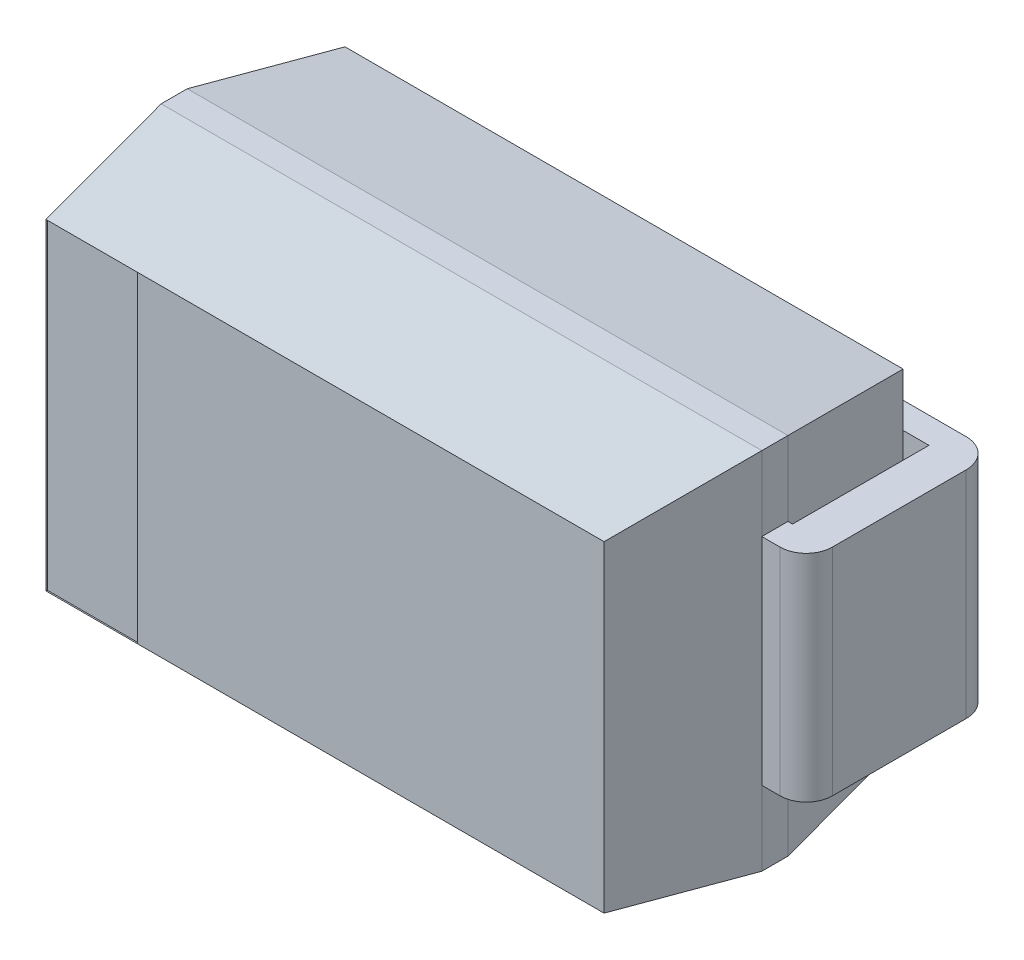
ISO-10303-21;
HEADER;
FILE_DESCRIPTION(('STEP AP214'),'2;1');
FILE_NAME('part.step','',(''),(''),'','','');
FILE_SCHEMA(('AUTOMOTIVE_DESIGN { 1 0 10303 214 1 1 1 1 }'));
ENDSEC;
DATA;
#1=APPLICATION_CONTEXT('core data for automotive mechanical design processes');
#2=APPLICATION_PROTOCOL_DEFINITION('international standard','automotive_design',2000,#1);
#3=PRODUCT_CONTEXT('',#1,'mechanical');
#4=PRODUCT('Part','Part','',(#3));
#5=PRODUCT_RELATED_PRODUCT_CATEGORY('part','',(#4));
#6=PRODUCT_DEFINITION_FORMATION('','',#4);
#7=PRODUCT_DEFINITION_CONTEXT('part definition',#1,'design');
#8=PRODUCT_DEFINITION('design','',#6,#7);
#9=PRODUCT_DEFINITION_SHAPE('','',#8);
#10=(LENGTH_UNIT() NAMED_UNIT(*) SI_UNIT(.MILLI.,.METRE.));
#11=(NAMED_UNIT(*) PLANE_ANGLE_UNIT() SI_UNIT($,.RADIAN.));
#12=(NAMED_UNIT(*) SI_UNIT($,.STERADIAN.) SOLID_ANGLE_UNIT());
#13=UNCERTAINTY_MEASURE_WITH_UNIT(LENGTH_MEASURE(1.E-05),#10,'distance_accuracy_value','');
#14=(GEOMETRIC_REPRESENTATION_CONTEXT(3) GLOBAL_UNCERTAINTY_ASSIGNED_CONTEXT((#13)) GLOBAL_UNIT_ASSIGNED_CONTEXT((#10,
#11,#12)) REPRESENTATION_CONTEXT('',''));
#15=CARTESIAN_POINT('',(0.,0.,0.));
#16=DIRECTION('',(0.,0.,1.));
#17=DIRECTION('',(1.,0.,0.));
#18=AXIS2_PLACEMENT_3D('',#15,#16,#17);
#19=CARTESIAN_POINT('',(2.3,-0.825,1.44500000000002));
#20=DIRECTION('',(0.,0.,1.));
#21=DIRECTION('',(-1.,0.,0.));
#22=AXIS2_PLACEMENT_3D('',#19,#20,#21);
#23=PLANE('',#22);
#24=DIRECTION('',(0.,1.,0.));
#25=VECTOR('',#24,1.);
#26=CARTESIAN_POINT('',(2.3,-0.825,1.44500000000002));
#27=LINE('',#26,#25);
#28=CARTESIAN_POINT('',(2.3,-0.825,1.44500000000002));
#29=VERTEX_POINT('',#28);
#30=CARTESIAN_POINT('',(2.3,0.825,1.44500000000002));
#31=VERTEX_POINT('',#30);
#32=EDGE_CURVE('E53',#29,#31,#27,.T.);
#33=ORIENTED_EDGE('',*,*,#32,.F.);
#34=DIRECTION('',(-1.,0.,0.));
#35=VECTOR('',#34,1.);
#36=CARTESIAN_POINT('',(2.3,-0.825,1.44500000000002));
#37=LINE('',#36,#35);
#38=CARTESIAN_POINT('',(2.44,-0.825,1.44500000000002));
#39=VERTEX_POINT('',#38);
#40=EDGE_CURVE('E199',#39,#29,#37,.T.);
#41=ORIENTED_EDGE('',*,*,#40,.F.);
#42=DIRECTION('',(0.,1.,0.));
#43=VECTOR('',#42,1.);
#44=CARTESIAN_POINT('',(2.44,-0.825,1.44500000000002));
#45=LINE('',#44,#43);
#46=CARTESIAN_POINT('',(2.44,0.825,1.44500000000002));
#47=VERTEX_POINT('',#46);
#48=EDGE_CURVE('E12',#39,#47,#45,.T.);
#49=ORIENTED_EDGE('',*,*,#48,.T.);
#50=DIRECTION('',(-1.,0.,0.));
#51=VECTOR('',#50,1.);
#52=CARTESIAN_POINT('',(2.3,0.825,1.44500000000002));
#53=LINE('',#52,#51);
#54=EDGE_CURVE('E132',#47,#31,#53,.T.);
#55=ORIENTED_EDGE('',*,*,#54,.T.);
#56=EDGE_LOOP('',(#33,#41,#49,#55));
#57=FACE_BOUND('',#56,.T.);
#58=ADVANCED_FACE('F50',(#57),#23,.T.);
#59=CARTESIAN_POINT('',(2.44,-0.825,1.24500000000002));
#60=DIRECTION('',(0.,1.,0.));
#61=DIRECTION('',(0.,0.,1.));
#62=AXIS2_PLACEMENT_3D('',#59,#60,#61);
#63=CYLINDRICAL_SURFACE('',#62,0.2);
#64=ORIENTED_EDGE('',*,*,#48,.F.);
#65=CARTESIAN_POINT('',(2.44,-0.825,1.24500000000002));
#66=DIRECTION('',(0.,-1.,0.));
#67=DIRECTION('',(0.,0.,-1.));
#68=AXIS2_PLACEMENT_3D('',#65,#66,#67);
#69=CIRCLE('',#68,0.2);
#70=CARTESIAN_POINT('',(2.64,-0.825,1.24500000000002));
#71=VERTEX_POINT('',#70);
#72=EDGE_CURVE('E66',#71,#39,#69,.T.);
#73=ORIENTED_EDGE('',*,*,#72,.F.);
#74=DIRECTION('',(0.,1.,0.));
#75=VECTOR('',#74,1.);
#76=CARTESIAN_POINT('',(2.64,-0.825,1.24500000000002));
#77=LINE('',#76,#75);
#78=CARTESIAN_POINT('',(2.64,0.825,1.24500000000002));
#79=VERTEX_POINT('',#78);
#80=EDGE_CURVE('E58',#71,#79,#77,.T.);
#81=ORIENTED_EDGE('',*,*,#80,.T.);
#82=CARTESIAN_POINT('',(2.44,0.825,1.24500000000002));
#83=DIRECTION('',(0.,-1.,0.));
#84=DIRECTION('',(0.,0.,-1.));
#85=AXIS2_PLACEMENT_3D('',#82,#83,#84);
#86=CIRCLE('',#85,0.2);
#87=EDGE_CURVE('E197',#79,#47,#86,.T.);
#88=ORIENTED_EDGE('',*,*,#87,.T.);
#89=EDGE_LOOP('',(#64,#73,#81,#88));
#90=FACE_BOUND('',#89,.T.);
#91=ADVANCED_FACE('F221',(#90),#63,.T.);
#92=CARTESIAN_POINT('',(2.64,-0.825,1.24500000000002));
#93=DIRECTION('',(1.,0.,0.));
#94=DIRECTION('',(0.,0.,1.));
#95=AXIS2_PLACEMENT_3D('',#92,#93,#94);
#96=PLANE('',#95);
#97=ORIENTED_EDGE('',*,*,#80,.F.);
#98=DIRECTION('',(0.,0.,1.));
#99=VECTOR('',#98,1.);
#100=CARTESIAN_POINT('',(2.64,-0.825,1.24500000000002));
#101=LINE('',#100,#99);
#102=CARTESIAN_POINT('',(2.64,-0.825,0.22));
#103=VERTEX_POINT('',#102);
#104=EDGE_CURVE('E71',#103,#71,#101,.T.);
#105=ORIENTED_EDGE('',*,*,#104,.F.);
#106=DIRECTION('',(0.,1.,0.));
#107=VECTOR('',#106,1.);
#108=CARTESIAN_POINT('',(2.64,-0.825,0.22));
#109=LINE('',#108,#107);
#110=CARTESIAN_POINT('',(2.64,0.825,0.22));
#111=VERTEX_POINT('',#110);
#112=EDGE_CURVE('E155',#103,#111,#109,.T.);
#113=ORIENTED_EDGE('',*,*,#112,.T.);
#114=DIRECTION('',(0.,0.,1.));
#115=VECTOR('',#114,1.);
#116=CARTESIAN_POINT('',(2.64,0.825,1.24500000000002));
#117=LINE('',#116,#115);
#118=EDGE_CURVE('E195',#111,#79,#117,.T.);
#119=ORIENTED_EDGE('',*,*,#118,.T.);
#120=EDGE_LOOP('',(#97,#105,#113,#119));
#121=FACE_BOUND('',#120,.T.);
#122=ADVANCED_FACE('F219',(#121),#96,.T.);
#123=CARTESIAN_POINT('',(2.42,-0.825,0.22));
#124=DIRECTION('',(0.,1.,0.));
#125=DIRECTION('',(0.,0.,1.));
#126=AXIS2_PLACEMENT_3D('',#123,#124,#125);
#127=CYLINDRICAL_SURFACE('',#126,0.22);
#128=ORIENTED_EDGE('',*,*,#112,.F.);
#129=CARTESIAN_POINT('',(2.42,-0.825,0.22));
#130=DIRECTION('',(0.,-1.,0.));
#131=DIRECTION('',(0.,0.,1.));
#132=AXIS2_PLACEMENT_3D('',#129,#130,#131);
#133=CIRCLE('',#132,0.22);
#134=CARTESIAN_POINT('',(2.42,-0.825,0.));
#135=VERTEX_POINT('',#134);
#136=EDGE_CURVE('E149',#135,#103,#133,.T.);
#137=ORIENTED_EDGE('',*,*,#136,.F.);
#138=DIRECTION('',(0.,1.,0.));
#139=VECTOR('',#138,1.);
#140=CARTESIAN_POINT('',(2.42,-0.825,0.));
#141=LINE('',#140,#139);
#142=CARTESIAN_POINT('',(2.42,0.825,0.));
#143=VERTEX_POINT('',#142);
#144=EDGE_CURVE('E158',#135,#143,#141,.T.);
#145=ORIENTED_EDGE('',*,*,#144,.T.);
#146=CARTESIAN_POINT('',(2.42,0.825,0.22));
#147=DIRECTION('',(0.,-1.,0.));
#148=DIRECTION('',(0.,0.,1.));
#149=AXIS2_PLACEMENT_3D('',#146,#147,#148);
#150=CIRCLE('',#149,0.22);
#151=EDGE_CURVE('E193',#143,#111,#150,.T.);
#152=ORIENTED_EDGE('',*,*,#151,.T.);
#153=EDGE_LOOP('',(#128,#137,#145,#152));
#154=FACE_BOUND('',#153,.T.);
#155=ADVANCED_FACE('F215',(#154),#127,.T.);
#156=CARTESIAN_POINT('',(1.12,-0.825,0.));
#157=DIRECTION('',(0.,0.,-1.));
#158=DIRECTION('',(1.,0.,0.));
#159=AXIS2_PLACEMENT_3D('',#156,#157,#158);
#160=PLANE('',#159);
#161=ORIENTED_EDGE('',*,*,#144,.F.);
#162=DIRECTION('',(1.,0.,0.));
#163=VECTOR('',#162,1.);
#164=CARTESIAN_POINT('',(1.12,-0.825,0.));
#165=LINE('',#164,#163);
#166=CARTESIAN_POINT('',(1.12,-0.825,0.));
#167=VERTEX_POINT('',#166);
#168=EDGE_CURVE('E208',#167,#135,#165,.T.);
#169=ORIENTED_EDGE('',*,*,#168,.F.);
#170=DIRECTION('',(0.,1.,0.));
#171=VECTOR('',#170,1.);
#172=CARTESIAN_POINT('',(1.12,-0.825,0.));
#173=LINE('',#172,#171);
#174=CARTESIAN_POINT('',(1.12,0.825,0.));
#175=VERTEX_POINT('',#174);
#176=EDGE_CURVE('E161',#167,#175,#173,.T.);
#177=ORIENTED_EDGE('',*,*,#176,.T.);
#178=DIRECTION('',(1.,0.,0.));
#179=VECTOR('',#178,1.);
#180=CARTESIAN_POINT('',(1.12,0.825,0.));
#181=LINE('',#180,#179);
#182=EDGE_CURVE('E191',#175,#143,#181,.T.);
#183=ORIENTED_EDGE('',*,*,#182,.T.);
#184=EDGE_LOOP('',(#161,#169,#177,#183));
#185=FACE_BOUND('',#184,.T.);
#186=ADVANCED_FACE('F232',(#185),#160,.T.);
#187=CARTESIAN_POINT('',(1.12,-0.825,0.));
#188=DIRECTION('',(-1.,0.,0.));
#189=DIRECTION('',(0.,0.,-1.));
#190=AXIS2_PLACEMENT_3D('',#187,#188,#189);
#191=PLANE('',#190);
#192=ORIENTED_EDGE('',*,*,#176,.F.);
#193=DIRECTION('',(0.,0.,-1.));
#194=VECTOR('',#193,1.);
#195=CARTESIAN_POINT('',(1.12,-0.825,0.));
#196=LINE('',#195,#194);
#197=CARTESIAN_POINT('',(1.12,-0.825,0.2));
#198=VERTEX_POINT('',#197);
#199=EDGE_CURVE('E206',#198,#167,#196,.T.);
#200=ORIENTED_EDGE('',*,*,#199,.F.);
#201=DIRECTION('',(0.,1.,0.));
#202=VECTOR('',#201,1.);
#203=CARTESIAN_POINT('',(1.12,-0.825,0.2));
#204=LINE('',#203,#202);
#205=CARTESIAN_POINT('',(1.12,0.825,0.2));
#206=VERTEX_POINT('',#205);
#207=EDGE_CURVE('E164',#198,#206,#204,.T.);
#208=ORIENTED_EDGE('',*,*,#207,.T.);
#209=DIRECTION('',(0.,0.,-1.));
#210=VECTOR('',#209,1.);
#211=CARTESIAN_POINT('',(1.12,0.825,0.));
#212=LINE('',#211,#210);
#213=EDGE_CURVE('E187',#206,#175,#212,.T.);
#214=ORIENTED_EDGE('',*,*,#213,.T.);
#215=EDGE_LOOP('',(#192,#200,#208,#214));
#216=FACE_BOUND('',#215,.T.);
#217=ADVANCED_FACE('F229',(#216),#191,.T.);
#218=CARTESIAN_POINT('',(1.12,-0.825,0.2));
#219=DIRECTION('',(0.,0.,1.));
#220=DIRECTION('',(-1.,0.,0.));
#221=AXIS2_PLACEMENT_3D('',#218,#219,#220);
#222=PLANE('',#221);
#223=ORIENTED_EDGE('',*,*,#207,.F.);
#224=DIRECTION('',(-1.,0.,0.));
#225=VECTOR('',#224,1.);
#226=CARTESIAN_POINT('',(1.12,-0.825,0.2));
#227=LINE('',#226,#225);
#228=CARTESIAN_POINT('',(2.335,-0.825,0.2));
#229=VERTEX_POINT('',#228);
#230=EDGE_CURVE('E204',#229,#198,#227,.T.);
#231=ORIENTED_EDGE('',*,*,#230,.F.);
#232=DIRECTION('',(0.,1.,0.));
#233=VECTOR('',#232,1.);
#234=CARTESIAN_POINT('',(2.335,-0.825,0.2));
#235=LINE('',#234,#233);
#236=CARTESIAN_POINT('',(2.335,0.825,0.2));
#237=VERTEX_POINT('',#236);
#238=EDGE_CURVE('E167',#229,#237,#235,.T.);
#239=ORIENTED_EDGE('',*,*,#238,.T.);
#240=DIRECTION('',(-1.,0.,0.));
#241=VECTOR('',#240,1.);
#242=CARTESIAN_POINT('',(1.12,0.825,0.2));
#243=LINE('',#242,#241);
#244=EDGE_CURVE('E185',#237,#206,#243,.T.);
#245=ORIENTED_EDGE('',*,*,#244,.T.);
#246=EDGE_LOOP('',(#223,#231,#239,#245));
#247=FACE_BOUND('',#246,.T.);
#248=ADVANCED_FACE('F225',(#247),#222,.T.);
#249=CARTESIAN_POINT('',(2.335,-0.825,0.2));
#250=DIRECTION('',(-1.,0.,0.));
#251=DIRECTION('',(0.,0.,-1.));
#252=AXIS2_PLACEMENT_3D('',#249,#250,#251);
#253=PLANE('',#252);
#254=ORIENTED_EDGE('',*,*,#238,.F.);
#255=DIRECTION('',(0.,0.,-1.));
#256=VECTOR('',#255,1.);
#257=CARTESIAN_POINT('',(2.335,-0.825,0.2));
#258=LINE('',#257,#256);
#259=CARTESIAN_POINT('',(2.335,-0.825,1.24500000000002));
#260=VERTEX_POINT('',#259);
#261=EDGE_CURVE('E178',#260,#229,#258,.T.);
#262=ORIENTED_EDGE('',*,*,#261,.F.);
#263=DIRECTION('',(0.,1.,0.));
#264=VECTOR('',#263,1.);
#265=CARTESIAN_POINT('',(2.335,-0.825,1.24500000000002));
#266=LINE('',#265,#264);
#267=CARTESIAN_POINT('',(2.335,0.825,1.24500000000002));
#268=VERTEX_POINT('',#267);
#269=EDGE_CURVE('E147',#260,#268,#266,.T.);
#270=ORIENTED_EDGE('',*,*,#269,.T.);
#271=DIRECTION('',(0.,0.,-1.));
#272=VECTOR('',#271,1.);
#273=CARTESIAN_POINT('',(2.335,0.825,0.2));
#274=LINE('',#273,#272);
#275=EDGE_CURVE('E176',#268,#237,#274,.T.);
#276=ORIENTED_EDGE('',*,*,#275,.T.);
#277=EDGE_LOOP('',(#254,#262,#270,#276));
#278=FACE_BOUND('',#277,.T.);
#279=ADVANCED_FACE('F175',(#278),#253,.T.);
#280=CARTESIAN_POINT('',(2.335,-0.825,1.24500000000002));
#281=DIRECTION('',(0.,0.,-1.));
#282=DIRECTION('',(1.,0.,0.));
#283=AXIS2_PLACEMENT_3D('',#280,#281,#282);
#284=PLANE('',#283);
#285=ORIENTED_EDGE('',*,*,#269,.F.);
#286=DIRECTION('',(1.,0.,0.));
#287=VECTOR('',#286,1.);
#288=CARTESIAN_POINT('',(2.335,-0.825,1.24500000000002));
#289=LINE('',#288,#287);
#290=CARTESIAN_POINT('',(2.3,-0.825,1.24500000000002));
#291=VERTEX_POINT('',#290);
#292=EDGE_CURVE('E182',#291,#260,#289,.T.);
#293=ORIENTED_EDGE('',*,*,#292,.F.);
#294=DIRECTION('',(0.,1.,0.));
#295=VECTOR('',#294,1.);
#296=CARTESIAN_POINT('',(2.3,-0.825,1.24500000000002));
#297=LINE('',#296,#295);
#298=CARTESIAN_POINT('',(2.3,0.825,1.24500000000002));
#299=VERTEX_POINT('',#298);
#300=EDGE_CURVE('E146',#291,#299,#297,.T.);
#301=ORIENTED_EDGE('',*,*,#300,.T.);
#302=DIRECTION('',(1.,0.,0.));
#303=VECTOR('',#302,1.);
#304=CARTESIAN_POINT('',(2.335,0.825,1.24500000000002));
#305=LINE('',#304,#303);
#306=EDGE_CURVE('E134',#299,#268,#305,.T.);
#307=ORIENTED_EDGE('',*,*,#306,.T.);
#308=EDGE_LOOP('',(#285,#293,#301,#307));
#309=FACE_BOUND('',#308,.T.);
#310=ADVANCED_FACE('F181',(#309),#284,.T.);
#311=CARTESIAN_POINT('',(2.3,-0.825,1.24500000000002));
#312=DIRECTION('',(-1.,0.,0.));
#313=DIRECTION('',(0.,0.,-1.));
#314=AXIS2_PLACEMENT_3D('',#311,#312,#313);
#315=PLANE('',#314);
#316=ORIENTED_EDGE('',*,*,#300,.F.);
#317=DIRECTION('',(0.,0.,-1.));
#318=VECTOR('',#317,1.);
#319=CARTESIAN_POINT('',(2.3,-0.825,1.24500000000002));
#320=LINE('',#319,#318);
#321=EDGE_CURVE('E145',#29,#291,#320,.T.);
#322=ORIENTED_EDGE('',*,*,#321,.F.);
#323=ORIENTED_EDGE('',*,*,#32,.T.);
#324=DIRECTION('',(0.,0.,-1.));
#325=VECTOR('',#324,1.);
#326=CARTESIAN_POINT('',(2.3,0.825,1.24500000000002));
#327=LINE('',#326,#325);
#328=EDGE_CURVE('E128',#31,#299,#327,.T.);
#329=ORIENTED_EDGE('',*,*,#328,.T.);
#330=EDGE_LOOP('',(#316,#322,#323,#329));
#331=FACE_BOUND('',#330,.T.);
#332=ADVANCED_FACE('F144',(#331),#315,.T.);
#333=CARTESIAN_POINT('',(2.44,-0.825,1.24500000000002));
#334=DIRECTION('',(0.,-1.,0.));
#335=DIRECTION('',(0.,0.,-1.));
#336=AXIS2_PLACEMENT_3D('',#333,#334,#335);
#337=PLANE('',#336);
#338=ORIENTED_EDGE('',*,*,#40,.T.);
#339=ORIENTED_EDGE('',*,*,#321,.T.);
#340=ORIENTED_EDGE('',*,*,#292,.T.);
#341=ORIENTED_EDGE('',*,*,#261,.T.);
#342=ORIENTED_EDGE('',*,*,#230,.T.);
#343=ORIENTED_EDGE('',*,*,#199,.T.);
#344=ORIENTED_EDGE('',*,*,#168,.T.);
#345=ORIENTED_EDGE('',*,*,#136,.T.);
#346=ORIENTED_EDGE('',*,*,#104,.T.);
#347=ORIENTED_EDGE('',*,*,#72,.T.);
#348=EDGE_LOOP('',(#338,#339,#340,#341,#342,#343,#344,#345,#346,#347));
#349=FACE_BOUND('',#348,.T.);
#350=ADVANCED_FACE('F211',(#349),#337,.T.);
#351=CARTESIAN_POINT('',(2.44,0.825,1.24500000000002));
#352=DIRECTION('',(0.,-1.,0.));
#353=DIRECTION('',(0.,0.,-1.));
#354=AXIS2_PLACEMENT_3D('',#351,#352,#353);
#355=PLANE('',#354);
#356=ORIENTED_EDGE('',*,*,#54,.F.);
#357=ORIENTED_EDGE('',*,*,#87,.F.);
#358=ORIENTED_EDGE('',*,*,#118,.F.);
#359=ORIENTED_EDGE('',*,*,#151,.F.);
#360=ORIENTED_EDGE('',*,*,#182,.F.);
#361=ORIENTED_EDGE('',*,*,#213,.F.);
#362=ORIENTED_EDGE('',*,*,#244,.F.);
#363=ORIENTED_EDGE('',*,*,#275,.F.);
#364=ORIENTED_EDGE('',*,*,#306,.F.);
#365=ORIENTED_EDGE('',*,*,#328,.F.);
#366=EDGE_LOOP('',(#356,#357,#358,#359,#360,#361,#362,#363,#364,#365));
#367=FACE_BOUND('',#366,.T.);
#368=ADVANCED_FACE('F130',(#367),#355,.F.);
#369=CLOSED_SHELL('',(#58,#91,#122,#155,#186,#217,#248,#279,#310,#332,#350,#368));
#370=MANIFOLD_SOLID_BREP('B2',#369);
#371=CARTESIAN_POINT('',(-2.3,-0.825,1.44500000000002));
#372=DIRECTION('',(0.,0.,1.));
#373=DIRECTION('',(1.,0.,0.));
#374=AXIS2_PLACEMENT_3D('',#371,#372,#373);
#375=PLANE('',#374);
#376=DIRECTION('',(0.,1.,0.));
#377=VECTOR('',#376,1.);
#378=CARTESIAN_POINT('',(-2.3,-0.825,1.44500000000002));
#379=LINE('',#378,#377);
#380=CARTESIAN_POINT('',(-2.3,-0.825,1.44500000000002));
#381=VERTEX_POINT('',#380);
#382=CARTESIAN_POINT('',(-2.3,0.825,1.44500000000002));
#383=VERTEX_POINT('',#382);
#384=EDGE_CURVE('E366',#381,#383,#379,.T.);
#385=ORIENTED_EDGE('',*,*,#384,.T.);
#386=DIRECTION('',(1.,0.,0.));
#387=VECTOR('',#386,1.);
#388=CARTESIAN_POINT('',(-2.3,0.825,1.44500000000002));
#389=LINE('',#388,#387);
#390=CARTESIAN_POINT('',(-2.44,0.825,1.44500000000002));
#391=VERTEX_POINT('',#390);
#392=EDGE_CURVE('E439',#391,#383,#389,.T.);
#393=ORIENTED_EDGE('',*,*,#392,.F.);
#394=DIRECTION('',(0.,1.,0.));
#395=VECTOR('',#394,1.);
#396=CARTESIAN_POINT('',(-2.44,-0.825,1.44500000000002));
#397=LINE('',#396,#395);
#398=CARTESIAN_POINT('',(-2.44,-0.825,1.44500000000002));
#399=VERTEX_POINT('',#398);
#400=EDGE_CURVE('E48',#399,#391,#397,.T.);
#401=ORIENTED_EDGE('',*,*,#400,.F.);
#402=DIRECTION('',(1.,0.,0.));
#403=VECTOR('',#402,1.);
#404=CARTESIAN_POINT('',(-2.3,-0.825,1.44500000000002));
#405=LINE('',#404,#403);
#406=EDGE_CURVE('E440',#399,#381,#405,.T.);
#407=ORIENTED_EDGE('',*,*,#406,.T.);
#408=EDGE_LOOP('',(#385,#393,#401,#407));
#409=FACE_BOUND('',#408,.T.);
#410=ADVANCED_FACE('F363',(#409),#375,.T.);
#411=CARTESIAN_POINT('',(-2.44,-0.825,1.24500000000002));
#412=DIRECTION('',(0.,1.,0.));
#413=DIRECTION('',(0.,0.,1.));
#414=AXIS2_PLACEMENT_3D('',#411,#412,#413);
#415=CYLINDRICAL_SURFACE('',#414,0.2);
#416=ORIENTED_EDGE('',*,*,#400,.T.);
#417=CARTESIAN_POINT('',(-2.44,0.825,1.24500000000002));
#418=DIRECTION('',(0.,1.,0.));
#419=DIRECTION('',(0.,0.,-1.));
#420=AXIS2_PLACEMENT_3D('',#417,#418,#419);
#421=CIRCLE('',#420,0.2);
#422=CARTESIAN_POINT('',(-2.64,0.825,1.24500000000002));
#423=VERTEX_POINT('',#422);
#424=EDGE_CURVE('E457',#423,#391,#421,.T.);
#425=ORIENTED_EDGE('',*,*,#424,.F.);
#426=DIRECTION('',(0.,1.,0.));
#427=VECTOR('',#426,1.);
#428=CARTESIAN_POINT('',(-2.64,-0.825,1.24500000000002));
#429=LINE('',#428,#427);
#430=CARTESIAN_POINT('',(-2.64,-0.825,1.24500000000002));
#431=VERTEX_POINT('',#430);
#432=EDGE_CURVE('E371',#431,#423,#429,.T.);
#433=ORIENTED_EDGE('',*,*,#432,.F.);
#434=CARTESIAN_POINT('',(-2.44,-0.825,1.24500000000002));
#435=DIRECTION('',(0.,1.,0.));
#436=DIRECTION('',(0.,0.,-1.));
#437=AXIS2_PLACEMENT_3D('',#434,#435,#436);
#438=CIRCLE('',#437,0.2);
#439=EDGE_CURVE('E445',#431,#399,#438,.T.);
#440=ORIENTED_EDGE('',*,*,#439,.T.);
#441=EDGE_LOOP('',(#416,#425,#433,#440));
#442=FACE_BOUND('',#441,.T.);
#443=ADVANCED_FACE('F545',(#442),#415,.T.);
#444=CARTESIAN_POINT('',(-2.64,-0.825,1.24500000000002));
#445=DIRECTION('',(-1.,0.,0.));
#446=DIRECTION('',(0.,0.,1.));
#447=AXIS2_PLACEMENT_3D('',#444,#445,#446);
#448=PLANE('',#447);
#449=ORIENTED_EDGE('',*,*,#432,.T.);
#450=DIRECTION('',(0.,0.,1.));
#451=VECTOR('',#450,1.);
#452=CARTESIAN_POINT('',(-2.64,0.825,1.24500000000002));
#453=LINE('',#452,#451);
#454=CARTESIAN_POINT('',(-2.64,0.825,0.22));
#455=VERTEX_POINT('',#454);
#456=EDGE_CURVE('E476',#455,#423,#453,.T.);
#457=ORIENTED_EDGE('',*,*,#456,.F.);
#458=DIRECTION('',(0.,1.,0.));
#459=VECTOR('',#458,1.);
#460=CARTESIAN_POINT('',(-2.64,-0.825,0.22));
#461=LINE('',#460,#459);
#462=CARTESIAN_POINT('',(-2.64,-0.825,0.22));
#463=VERTEX_POINT('',#462);
#464=EDGE_CURVE('E504',#463,#455,#461,.T.);
#465=ORIENTED_EDGE('',*,*,#464,.F.);
#466=DIRECTION('',(0.,0.,1.));
#467=VECTOR('',#466,1.);
#468=CARTESIAN_POINT('',(-2.64,-0.825,1.24500000000002));
#469=LINE('',#468,#467);
#470=EDGE_CURVE('E500',#463,#431,#469,.T.);
#471=ORIENTED_EDGE('',*,*,#470,.T.);
#472=EDGE_LOOP('',(#449,#457,#465,#471));
#473=FACE_BOUND('',#472,.T.);
#474=ADVANCED_FACE('F543',(#473),#448,.T.);
#475=CARTESIAN_POINT('',(-2.42,-0.825,0.22));
#476=DIRECTION('',(0.,1.,0.));
#477=DIRECTION('',(0.,0.,1.));
#478=AXIS2_PLACEMENT_3D('',#475,#476,#477);
#479=CYLINDRICAL_SURFACE('',#478,0.22);
#480=ORIENTED_EDGE('',*,*,#464,.T.);
#481=CARTESIAN_POINT('',(-2.42,0.825,0.22));
#482=DIRECTION('',(0.,1.,0.));
#483=DIRECTION('',(0.,0.,1.));
#484=AXIS2_PLACEMENT_3D('',#481,#482,#483);
#485=CIRCLE('',#484,0.22);
#486=CARTESIAN_POINT('',(-2.42,0.825,0.));
#487=VERTEX_POINT('',#486);
#488=EDGE_CURVE('E473',#487,#455,#485,.T.);
#489=ORIENTED_EDGE('',*,*,#488,.F.);
#490=DIRECTION('',(0.,1.,0.));
#491=VECTOR('',#490,1.);
#492=CARTESIAN_POINT('',(-2.42,-0.825,0.));
#493=LINE('',#492,#491);
#494=CARTESIAN_POINT('',(-2.42,-0.825,0.));
#495=VERTEX_POINT('',#494);
#496=EDGE_CURVE('E506',#495,#487,#493,.T.);
#497=ORIENTED_EDGE('',*,*,#496,.F.);
#498=CARTESIAN_POINT('',(-2.42,-0.825,0.22));
#499=DIRECTION('',(0.,1.,0.));
#500=DIRECTION('',(0.,0.,1.));
#501=AXIS2_PLACEMENT_3D('',#498,#499,#500);
#502=CIRCLE('',#501,0.22);
#503=EDGE_CURVE('E497',#495,#463,#502,.T.);
#504=ORIENTED_EDGE('',*,*,#503,.T.);
#505=EDGE_LOOP('',(#480,#489,#497,#504));
#506=FACE_BOUND('',#505,.T.);
#507=ADVANCED_FACE('F539',(#506),#479,.T.);
#508=CARTESIAN_POINT('',(-1.12,-0.825,0.));
#509=DIRECTION('',(0.,0.,-1.));
#510=DIRECTION('',(-1.,0.,0.));
#511=AXIS2_PLACEMENT_3D('',#508,#509,#510);
#512=PLANE('',#511);
#513=ORIENTED_EDGE('',*,*,#496,.T.);
#514=DIRECTION('',(-1.,0.,0.));
#515=VECTOR('',#514,1.);
#516=CARTESIAN_POINT('',(-1.12,0.825,0.));
#517=LINE('',#516,#515);
#518=CARTESIAN_POINT('',(-1.12,0.825,0.));
#519=VERTEX_POINT('',#518);
#520=EDGE_CURVE('E470',#519,#487,#517,.T.);
#521=ORIENTED_EDGE('',*,*,#520,.F.);
#522=DIRECTION('',(0.,1.,0.));
#523=VECTOR('',#522,1.);
#524=CARTESIAN_POINT('',(-1.12,-0.825,0.));
#525=LINE('',#524,#523);
#526=CARTESIAN_POINT('',(-1.12,-0.825,0.));
#527=VERTEX_POINT('',#526);
#528=EDGE_CURVE('E508',#527,#519,#525,.T.);
#529=ORIENTED_EDGE('',*,*,#528,.F.);
#530=DIRECTION('',(-1.,0.,0.));
#531=VECTOR('',#530,1.);
#532=CARTESIAN_POINT('',(-1.12,-0.825,0.));
#533=LINE('',#532,#531);
#534=EDGE_CURVE('E494',#527,#495,#533,.T.);
#535=ORIENTED_EDGE('',*,*,#534,.T.);
#536=EDGE_LOOP('',(#513,#521,#529,#535));
#537=FACE_BOUND('',#536,.T.);
#538=ADVANCED_FACE('F537',(#537),#512,.T.);
#539=CARTESIAN_POINT('',(-1.12,-0.825,0.));
#540=DIRECTION('',(1.,0.,0.));
#541=DIRECTION('',(0.,0.,-1.));
#542=AXIS2_PLACEMENT_3D('',#539,#540,#541);
#543=PLANE('',#542);
#544=ORIENTED_EDGE('',*,*,#528,.T.);
#545=DIRECTION('',(0.,0.,-1.));
#546=VECTOR('',#545,1.);
#547=CARTESIAN_POINT('',(-1.12,0.825,0.));
#548=LINE('',#547,#546);
#549=CARTESIAN_POINT('',(-1.12,0.825,0.2));
#550=VERTEX_POINT('',#549);
#551=EDGE_CURVE('E467',#550,#519,#548,.T.);
#552=ORIENTED_EDGE('',*,*,#551,.F.);
#553=DIRECTION('',(0.,1.,0.));
#554=VECTOR('',#553,1.);
#555=CARTESIAN_POINT('',(-1.12,-0.825,0.2));
#556=LINE('',#555,#554);
#557=CARTESIAN_POINT('',(-1.12,-0.825,0.2));
#558=VERTEX_POINT('',#557);
#559=EDGE_CURVE('E510',#558,#550,#556,.T.);
#560=ORIENTED_EDGE('',*,*,#559,.F.);
#561=DIRECTION('',(0.,0.,-1.));
#562=VECTOR('',#561,1.);
#563=CARTESIAN_POINT('',(-1.12,-0.825,0.));
#564=LINE('',#563,#562);
#565=EDGE_CURVE('E491',#558,#527,#564,.T.);
#566=ORIENTED_EDGE('',*,*,#565,.T.);
#567=EDGE_LOOP('',(#544,#552,#560,#566));
#568=FACE_BOUND('',#567,.T.);
#569=ADVANCED_FACE('F532',(#568),#543,.T.);
#570=CARTESIAN_POINT('',(-1.12,-0.825,0.2));
#571=DIRECTION('',(0.,0.,1.));
#572=DIRECTION('',(1.,0.,0.));
#573=AXIS2_PLACEMENT_3D('',#570,#571,#572);
#574=PLANE('',#573);
#575=ORIENTED_EDGE('',*,*,#559,.T.);
#576=DIRECTION('',(1.,0.,0.));
#577=VECTOR('',#576,1.);
#578=CARTESIAN_POINT('',(-1.12,0.825,0.2));
#579=LINE('',#578,#577);
#580=CARTESIAN_POINT('',(-2.335,0.825,0.2));
#581=VERTEX_POINT('',#580);
#582=EDGE_CURVE('E464',#581,#550,#579,.T.);
#583=ORIENTED_EDGE('',*,*,#582,.F.);
#584=DIRECTION('',(0.,1.,0.));
#585=VECTOR('',#584,1.);
#586=CARTESIAN_POINT('',(-2.335,-0.825,0.2));
#587=LINE('',#586,#585);
#588=CARTESIAN_POINT('',(-2.335,-0.825,0.2));
#589=VERTEX_POINT('',#588);
#590=EDGE_CURVE('E512',#589,#581,#587,.T.);
#591=ORIENTED_EDGE('',*,*,#590,.F.);
#592=DIRECTION('',(1.,0.,0.));
#593=VECTOR('',#592,1.);
#594=CARTESIAN_POINT('',(-1.12,-0.825,0.2));
#595=LINE('',#594,#593);
#596=EDGE_CURVE('E488',#589,#558,#595,.T.);
#597=ORIENTED_EDGE('',*,*,#596,.T.);
#598=EDGE_LOOP('',(#575,#583,#591,#597));
#599=FACE_BOUND('',#598,.T.);
#600=ADVANCED_FACE('F525',(#599),#574,.T.);
#601=CARTESIAN_POINT('',(-2.335,-0.825,0.2));
#602=DIRECTION('',(1.,0.,0.));
#603=DIRECTION('',(0.,0.,-1.));
#604=AXIS2_PLACEMENT_3D('',#601,#602,#603);
#605=PLANE('',#604);
#606=ORIENTED_EDGE('',*,*,#590,.T.);
#607=DIRECTION('',(0.,0.,-1.));
#608=VECTOR('',#607,1.);
#609=CARTESIAN_POINT('',(-2.335,0.825,0.2));
#610=LINE('',#609,#608);
#611=CARTESIAN_POINT('',(-2.335,0.825,1.24500000000002));
#612=VERTEX_POINT('',#611);
#613=EDGE_CURVE('E461',#612,#581,#610,.T.);
#614=ORIENTED_EDGE('',*,*,#613,.F.);
#615=DIRECTION('',(0.,1.,0.));
#616=VECTOR('',#615,1.);
#617=CARTESIAN_POINT('',(-2.335,-0.825,1.24500000000002));
#618=LINE('',#617,#616);
#619=CARTESIAN_POINT('',(-2.335,-0.825,1.24500000000002));
#620=VERTEX_POINT('',#619);
#621=EDGE_CURVE('E514',#620,#612,#618,.T.);
#622=ORIENTED_EDGE('',*,*,#621,.F.);
#623=DIRECTION('',(0.,0.,-1.));
#624=VECTOR('',#623,1.);
#625=CARTESIAN_POINT('',(-2.335,-0.825,0.2));
#626=LINE('',#625,#624);
#627=EDGE_CURVE('E485',#620,#589,#626,.T.);
#628=ORIENTED_EDGE('',*,*,#627,.T.);
#629=EDGE_LOOP('',(#606,#614,#622,#628));
#630=FACE_BOUND('',#629,.T.);
#631=ADVANCED_FACE('F522',(#630),#605,.T.);
#632=CARTESIAN_POINT('',(-2.335,-0.825,1.24500000000002));
#633=DIRECTION('',(0.,0.,-1.));
#634=DIRECTION('',(-1.,0.,0.));
#635=AXIS2_PLACEMENT_3D('',#632,#633,#634);
#636=PLANE('',#635);
#637=ORIENTED_EDGE('',*,*,#621,.T.);
#638=DIRECTION('',(-1.,0.,0.));
#639=VECTOR('',#638,1.);
#640=CARTESIAN_POINT('',(-2.335,0.825,1.24500000000002));
#641=LINE('',#640,#639);
#642=CARTESIAN_POINT('',(-2.3,0.825,1.24500000000002));
#643=VERTEX_POINT('',#642);
#644=EDGE_CURVE('E452',#643,#612,#641,.T.);
#645=ORIENTED_EDGE('',*,*,#644,.F.);
#646=DIRECTION('',(0.,1.,0.));
#647=VECTOR('',#646,1.);
#648=CARTESIAN_POINT('',(-2.3,-0.825,1.24500000000002));
#649=LINE('',#648,#647);
#650=CARTESIAN_POINT('',(-2.3,-0.825,1.24500000000002));
#651=VERTEX_POINT('',#650);
#652=EDGE_CURVE('E444',#651,#643,#649,.T.);
#653=ORIENTED_EDGE('',*,*,#652,.F.);
#654=DIRECTION('',(-1.,0.,0.));
#655=VECTOR('',#654,1.);
#656=CARTESIAN_POINT('',(-2.335,-0.825,1.24500000000002));
#657=LINE('',#656,#655);
#658=EDGE_CURVE('E482',#651,#620,#657,.T.);
#659=ORIENTED_EDGE('',*,*,#658,.T.);
#660=EDGE_LOOP('',(#637,#645,#653,#659));
#661=FACE_BOUND('',#660,.T.);
#662=ADVANCED_FACE('F516',(#661),#636,.T.);
#663=CARTESIAN_POINT('',(-2.3,-0.825,1.24500000000002));
#664=DIRECTION('',(1.,0.,0.));
#665=DIRECTION('',(0.,0.,-1.));
#666=AXIS2_PLACEMENT_3D('',#663,#664,#665);
#667=PLANE('',#666);
#668=ORIENTED_EDGE('',*,*,#652,.T.);
#669=DIRECTION('',(0.,0.,-1.));
#670=VECTOR('',#669,1.);
#671=CARTESIAN_POINT('',(-2.3,0.825,1.24500000000002));
#672=LINE('',#671,#670);
#673=EDGE_CURVE('E447',#383,#643,#672,.T.);
#674=ORIENTED_EDGE('',*,*,#673,.F.);
#675=ORIENTED_EDGE('',*,*,#384,.F.);
#676=DIRECTION('',(0.,0.,-1.));
#677=VECTOR('',#676,1.);
#678=CARTESIAN_POINT('',(-2.3,-0.825,1.24500000000002));
#679=LINE('',#678,#677);
#680=EDGE_CURVE('E480',#381,#651,#679,.T.);
#681=ORIENTED_EDGE('',*,*,#680,.T.);
#682=EDGE_LOOP('',(#668,#674,#675,#681));
#683=FACE_BOUND('',#682,.T.);
#684=ADVANCED_FACE('F448',(#683),#667,.T.);
#685=CARTESIAN_POINT('',(-2.44,-0.825,1.24500000000002));
#686=DIRECTION('',(0.,-1.,0.));
#687=DIRECTION('',(0.,0.,-1.));
#688=AXIS2_PLACEMENT_3D('',#685,#686,#687);
#689=PLANE('',#688);
#690=ORIENTED_EDGE('',*,*,#406,.F.);
#691=ORIENTED_EDGE('',*,*,#439,.F.);
#692=ORIENTED_EDGE('',*,*,#470,.F.);
#693=ORIENTED_EDGE('',*,*,#503,.F.);
#694=ORIENTED_EDGE('',*,*,#534,.F.);
#695=ORIENTED_EDGE('',*,*,#565,.F.);
#696=ORIENTED_EDGE('',*,*,#596,.F.);
#697=ORIENTED_EDGE('',*,*,#627,.F.);
#698=ORIENTED_EDGE('',*,*,#658,.F.);
#699=ORIENTED_EDGE('',*,*,#680,.F.);
#700=EDGE_LOOP('',(#690,#691,#692,#693,#694,#695,#696,#697,#698,#699));
#701=FACE_BOUND('',#700,.T.);
#702=ADVANCED_FACE('F528',(#701),#689,.T.);
#703=CARTESIAN_POINT('',(-2.44,0.825,1.24500000000002));
#704=DIRECTION('',(0.,-1.,0.));
#705=DIRECTION('',(0.,0.,-1.));
#706=AXIS2_PLACEMENT_3D('',#703,#704,#705);
#707=PLANE('',#706);
#708=ORIENTED_EDGE('',*,*,#392,.T.);
#709=ORIENTED_EDGE('',*,*,#673,.T.);
#710=ORIENTED_EDGE('',*,*,#644,.T.);
#711=ORIENTED_EDGE('',*,*,#613,.T.);
#712=ORIENTED_EDGE('',*,*,#582,.T.);
#713=ORIENTED_EDGE('',*,*,#551,.T.);
#714=ORIENTED_EDGE('',*,*,#520,.T.);
#715=ORIENTED_EDGE('',*,*,#488,.T.);
#716=ORIENTED_EDGE('',*,*,#456,.T.);
#717=ORIENTED_EDGE('',*,*,#424,.T.);
#718=EDGE_LOOP('',(#708,#709,#710,#711,#712,#713,#714,#715,#716,#717));
#719=FACE_BOUND('',#718,.T.);
#720=ADVANCED_FACE('F455',(#719),#707,.F.);
#721=CLOSED_SHELL('',(#410,#443,#474,#507,#538,#569,#600,#631,#662,#684,#702,#720));
#722=MANIFOLD_SOLID_BREP('B6',#721);
#723=CARTESIAN_POINT('',(2.3,1.395,2.49));
#724=DIRECTION('',(-1.,0.,0.));
#725=DIRECTION('',(0.,0.,1.));
#726=AXIS2_PLACEMENT_3D('',#723,#724,#725);
#727=PLANE('',#726);
#728=DIRECTION('',(0.,0.,-1.));
#729=VECTOR('',#728,1.);
#730=CARTESIAN_POINT('',(2.3,-1.395,2.49));
#731=LINE('',#730,#729);
#732=CARTESIAN_POINT('',(2.3,-1.395,1.44499999999998));
#733=VERTEX_POINT('',#732);
#734=CARTESIAN_POINT('',(2.3,-1.395,1.24500000000002));
#735=VERTEX_POINT('',#734);
#736=EDGE_CURVE('E766',#733,#735,#731,.T.);
#737=ORIENTED_EDGE('',*,*,#736,.T.);
#738=DIRECTION('',(0.,1.,0.));
#739=VECTOR('',#738,1.);
#740=CARTESIAN_POINT('',(2.3,1.395,1.24500000000002));
#741=LINE('',#740,#739);
#742=CARTESIAN_POINT('',(2.3,1.395,1.24500000000002));
#743=VERTEX_POINT('',#742);
#744=EDGE_CURVE('E795',#735,#743,#741,.T.);
#745=ORIENTED_EDGE('',*,*,#744,.T.);
#746=DIRECTION('',(0.,0.,-1.));
#747=VECTOR('',#746,1.);
#748=CARTESIAN_POINT('',(2.3,1.395,2.49));
#749=LINE('',#748,#747);
#750=CARTESIAN_POINT('',(2.3,1.395,1.44499999999998));
#751=VERTEX_POINT('',#750);
#752=EDGE_CURVE('E774',#751,#743,#749,.T.);
#753=ORIENTED_EDGE('',*,*,#752,.F.);
#754=DIRECTION('',(0.,-1.,0.));
#755=VECTOR('',#754,1.);
#756=CARTESIAN_POINT('',(2.3,-1.395,1.44499999999998));
#757=LINE('',#756,#755);
#758=EDGE_CURVE('E789',#751,#733,#757,.T.);
#759=ORIENTED_EDGE('',*,*,#758,.T.);
#760=EDGE_LOOP('',(#737,#745,#753,#759));
#761=FACE_BOUND('',#760,.T.);
#762=ADVANCED_FACE('F643',(#761),#727,.F.);
#763=CARTESIAN_POINT('',(-2.3,1.395,2.49));
#764=DIRECTION('',(0.,-1.,0.));
#765=DIRECTION('',(0.,0.,-1.));
#766=AXIS2_PLACEMENT_3D('',#763,#764,#765);
#767=PLANE('',#766);
#768=ORIENTED_EDGE('',*,*,#752,.T.);
#769=DIRECTION('',(-1.,0.,0.));
#770=VECTOR('',#769,1.);
#771=CARTESIAN_POINT('',(-2.3,1.395,1.24500000000002));
#772=LINE('',#771,#770);
#773=CARTESIAN_POINT('',(-2.3,1.395,1.24500000000002));
#774=VERTEX_POINT('',#773);
#775=EDGE_CURVE('E817',#743,#774,#772,.T.);
#776=ORIENTED_EDGE('',*,*,#775,.T.);
#777=DIRECTION('',(0.,0.,-1.));
#778=VECTOR('',#777,1.);
#779=CARTESIAN_POINT('',(-2.3,1.395,2.49));
#780=LINE('',#779,#778);
#781=CARTESIAN_POINT('',(-2.3,1.395,1.44499999999998));
#782=VERTEX_POINT('',#781);
#783=EDGE_CURVE('E772',#782,#774,#780,.T.);
#784=ORIENTED_EDGE('',*,*,#783,.F.);
#785=DIRECTION('',(1.,0.,0.));
#786=VECTOR('',#785,1.);
#787=CARTESIAN_POINT('',(2.3,1.395,1.44499999999998));
#788=LINE('',#787,#786);
#789=EDGE_CURVE('E786',#782,#751,#788,.T.);
#790=ORIENTED_EDGE('',*,*,#789,.T.);
#791=EDGE_LOOP('',(#768,#776,#784,#790));
#792=FACE_BOUND('',#791,.T.);
#793=ADVANCED_FACE('F850',(#792),#767,.F.);
#794=CARTESIAN_POINT('',(-2.3,1.395,2.49));
#795=DIRECTION('',(1.,0.,0.));
#796=DIRECTION('',(0.,1.,0.));
#797=AXIS2_PLACEMENT_3D('',#794,#795,#796);
#798=PLANE('',#797);
#799=ORIENTED_EDGE('',*,*,#783,.T.);
#800=DIRECTION('',(0.,-1.,0.));
#801=VECTOR('',#800,1.);
#802=CARTESIAN_POINT('',(-2.3,1.395,1.24500000000002));
#803=LINE('',#802,#801);
#804=CARTESIAN_POINT('',(-2.3,-1.395,1.24500000000002));
#805=VERTEX_POINT('',#804);
#806=EDGE_CURVE('E361',#774,#805,#803,.T.);
#807=ORIENTED_EDGE('',*,*,#806,.T.);
#808=DIRECTION('',(0.,0.,-1.));
#809=VECTOR('',#808,1.);
#810=CARTESIAN_POINT('',(-2.3,-1.395,2.49));
#811=LINE('',#810,#809);
#812=CARTESIAN_POINT('',(-2.3,-1.395,1.44499999999998));
#813=VERTEX_POINT('',#812);
#814=EDGE_CURVE('E769',#813,#805,#811,.T.);
#815=ORIENTED_EDGE('',*,*,#814,.F.);
#816=DIRECTION('',(0.,1.,0.));
#817=VECTOR('',#816,1.);
#818=CARTESIAN_POINT('',(-2.3,1.395,1.44499999999998));
#819=LINE('',#818,#817);
#820=EDGE_CURVE('E793',#813,#782,#819,.T.);
#821=ORIENTED_EDGE('',*,*,#820,.T.);
#822=EDGE_LOOP('',(#799,#807,#815,#821));
#823=FACE_BOUND('',#822,.T.);
#824=ADVANCED_FACE('F887',(#823),#798,.F.);
#825=CARTESIAN_POINT('',(-2.3,-1.395,2.49));
#826=DIRECTION('',(0.,1.,0.));
#827=DIRECTION('',(0.,0.,1.));
#828=AXIS2_PLACEMENT_3D('',#825,#826,#827);
#829=PLANE('',#828);
#830=ORIENTED_EDGE('',*,*,#814,.T.);
#831=DIRECTION('',(1.,0.,0.));
#832=VECTOR('',#831,1.);
#833=CARTESIAN_POINT('',(-2.3,-1.395,1.24500000000002));
#834=LINE('',#833,#832);
#835=EDGE_CURVE('E652',#805,#735,#834,.T.);
#836=ORIENTED_EDGE('',*,*,#835,.T.);
#837=ORIENTED_EDGE('',*,*,#736,.F.);
#838=DIRECTION('',(-1.,0.,0.));
#839=VECTOR('',#838,1.);
#840=CARTESIAN_POINT('',(-2.3,-1.395,1.44499999999998));
#841=LINE('',#840,#839);
#842=EDGE_CURVE('E791',#733,#813,#841,.T.);
#843=ORIENTED_EDGE('',*,*,#842,.T.);
#844=EDGE_LOOP('',(#830,#836,#837,#843));
#845=FACE_BOUND('',#844,.T.);
#846=ADVANCED_FACE('F940',(#845),#829,.F.);
#847=CARTESIAN_POINT('',(0.,0.,2.49));
#848=DIRECTION('',(0.,0.,1.));
#849=DIRECTION('',(1.,0.,0.));
#850=AXIS2_PLACEMENT_3D('',#847,#848,#849);
#851=PLANE('',#850);
#852=DIRECTION('',(0.,1.,0.));
#853=VECTOR('',#852,1.);
#854=CARTESIAN_POINT('',(-1.437,-1.232,2.49));
#855=LINE('',#854,#853);
#856=CARTESIAN_POINT('',(-1.437,-1.232,2.49));
#857=VERTEX_POINT('',#856);
#858=CARTESIAN_POINT('',(-1.437,1.232,2.49));
#859=VERTEX_POINT('',#858);
#860=EDGE_CURVE('E660',#857,#859,#855,.T.);
#861=ORIENTED_EDGE('',*,*,#860,.F.);
#862=DIRECTION('',(1.,0.,0.));
#863=VECTOR('',#862,1.);
#864=CARTESIAN_POINT('',(2.3,-1.232,2.49));
#865=LINE('',#864,#863);
#866=CARTESIAN_POINT('',(2.137,-1.232,2.49));
#867=VERTEX_POINT('',#866);
#868=EDGE_CURVE('E778',#857,#867,#865,.T.);
#869=ORIENTED_EDGE('',*,*,#868,.T.);
#870=DIRECTION('',(0.,1.,0.));
#871=VECTOR('',#870,1.);
#872=CARTESIAN_POINT('',(2.137,1.395,2.49));
#873=LINE('',#872,#871);
#874=CARTESIAN_POINT('',(2.137,1.232,2.49));
#875=VERTEX_POINT('',#874);
#876=EDGE_CURVE('E781',#867,#875,#873,.T.);
#877=ORIENTED_EDGE('',*,*,#876,.T.);
#878=DIRECTION('',(-1.,0.,0.));
#879=VECTOR('',#878,1.);
#880=CARTESIAN_POINT('',(-2.3,1.232,2.49));
#881=LINE('',#880,#879);
#882=EDGE_CURVE('E783',#875,#859,#881,.T.);
#883=ORIENTED_EDGE('',*,*,#882,.T.);
#884=EDGE_LOOP('',(#861,#869,#877,#883));
#885=FACE_BOUND('',#884,.T.);
#886=ADVANCED_FACE('F869',(#885),#851,.T.);
#887=CARTESIAN_POINT('',(0.,0.,0.2));
#888=DIRECTION('',(0.,0.,1.));
#889=DIRECTION('',(1.,0.,0.));
#890=AXIS2_PLACEMENT_3D('',#887,#888,#889);
#891=PLANE('',#890);
#892=DIRECTION('',(1.,0.,0.));
#893=VECTOR('',#892,1.);
#894=CARTESIAN_POINT('',(0.,1.232,0.2));
#895=LINE('',#894,#893);
#896=CARTESIAN_POINT('',(-2.137,1.232,0.2));
#897=VERTEX_POINT('',#896);
#898=CARTESIAN_POINT('',(2.137,1.232,0.2));
#899=VERTEX_POINT('',#898);
#900=EDGE_CURVE('E812',#897,#899,#895,.T.);
#901=ORIENTED_EDGE('',*,*,#900,.T.);
#902=DIRECTION('',(0.,-1.,0.));
#903=VECTOR('',#902,1.);
#904=CARTESIAN_POINT('',(2.137,0.,0.2));
#905=LINE('',#904,#903);
#906=CARTESIAN_POINT('',(2.137,-1.232,0.2));
#907=VERTEX_POINT('',#906);
#908=EDGE_CURVE('E814',#899,#907,#905,.T.);
#909=ORIENTED_EDGE('',*,*,#908,.T.);
#910=DIRECTION('',(-1.,0.,0.));
#911=VECTOR('',#910,1.);
#912=CARTESIAN_POINT('',(0.,-1.232,0.2));
#913=LINE('',#912,#911);
#914=CARTESIAN_POINT('',(-2.137,-1.232,0.2));
#915=VERTEX_POINT('',#914);
#916=EDGE_CURVE('E810',#907,#915,#913,.T.);
#917=ORIENTED_EDGE('',*,*,#916,.T.);
#918=DIRECTION('',(0.,1.,0.));
#919=VECTOR('',#918,1.);
#920=CARTESIAN_POINT('',(-2.137,0.,0.2));
#921=LINE('',#920,#919);
#922=EDGE_CURVE('E808',#915,#897,#921,.T.);
#923=ORIENTED_EDGE('',*,*,#922,.T.);
#924=EDGE_LOOP('',(#901,#909,#917,#923));
#925=FACE_BOUND('',#924,.T.);
#926=ADVANCED_FACE('F838',(#925),#891,.F.);
#927=CARTESIAN_POINT('',(0.,-1.232,2.49));
#928=DIRECTION('',(0.,-0.988052559914842,0.154117289249871));
#929=DIRECTION('',(-1.,0.,0.));
#930=AXIS2_PLACEMENT_3D('',#927,#928,#929);
#931=PLANE('',#930);
#932=DIRECTION('',(0.152318954675182,0.152318954675182,0.976523359727416));
#933=VECTOR('',#932,1.);
#934=CARTESIAN_POINT('',(-2.10841628920948,-1.20341628920948,2.67325139739932));
#935=LINE('',#934,#933);
#936=CARTESIAN_POINT('',(-2.137,-1.232,2.49));
#937=VERTEX_POINT('',#936);
#938=EDGE_CURVE('E801',#813,#937,#935,.T.);
#939=ORIENTED_EDGE('',*,*,#938,.F.);
#940=ORIENTED_EDGE('',*,*,#842,.F.);
#941=DIRECTION('',(-0.152318954675182,0.152318954675182,0.976523359727416));
#942=VECTOR('',#941,1.);
#943=CARTESIAN_POINT('',(2.08741932633171,-1.18241932633171,2.80786382811879));
#944=LINE('',#943,#942);
#945=EDGE_CURVE('E770',#867,#733,#944,.F.);
#946=ORIENTED_EDGE('',*,*,#945,.F.);
#947=ORIENTED_EDGE('',*,*,#868,.F.);
#948=EDGE_CURVE('E779',#937,#857,#865,.T.);
#949=ORIENTED_EDGE('',*,*,#948,.F.);
#950=EDGE_LOOP('',(#939,#940,#946,#947,#949));
#951=FACE_BOUND('',#950,.T.);
#952=ADVANCED_FACE('F865',(#951),#931,.T.);
#953=CARTESIAN_POINT('',(2.137,0.,2.49));
#954=DIRECTION('',(0.988052559914842,0.,0.154117289249871));
#955=DIRECTION('',(0.,-1.,0.));
#956=AXIS2_PLACEMENT_3D('',#953,#954,#955);
#957=PLANE('',#956);
#958=ORIENTED_EDGE('',*,*,#945,.T.);
#959=ORIENTED_EDGE('',*,*,#758,.F.);
#960=DIRECTION('',(-0.152318954675182,-0.152318954675182,0.976523359727416));
#961=VECTOR('',#960,1.);
#962=CARTESIAN_POINT('',(2.10841628920948,1.20341628920949,2.67325139739932));
#963=LINE('',#962,#961);
#964=EDGE_CURVE('E799',#875,#751,#963,.F.);
#965=ORIENTED_EDGE('',*,*,#964,.F.);
#966=ORIENTED_EDGE('',*,*,#876,.F.);
#967=EDGE_LOOP('',(#958,#959,#965,#966));
#968=FACE_BOUND('',#967,.T.);
#969=ADVANCED_FACE('F895',(#968),#957,.T.);
#970=CARTESIAN_POINT('',(-2.137,0.,2.49));
#971=DIRECTION('',(-0.988052559914842,0.,0.154117289249871));
#972=DIRECTION('',(0.,1.,0.));
#973=AXIS2_PLACEMENT_3D('',#970,#971,#972);
#974=PLANE('',#973);
#975=ORIENTED_EDGE('',*,*,#938,.T.);
#976=DIRECTION('',(0.,-1.,0.));
#977=VECTOR('',#976,1.);
#978=CARTESIAN_POINT('',(-2.137,-1.395,2.49));
#979=LINE('',#978,#977);
#980=CARTESIAN_POINT('',(-2.137,1.232,2.49));
#981=VERTEX_POINT('',#980);
#982=EDGE_CURVE('E735',#981,#937,#979,.T.);
#983=ORIENTED_EDGE('',*,*,#982,.F.);
#984=DIRECTION('',(-0.152318954675182,0.152318954675182,-0.976523359727416));
#985=VECTOR('',#984,1.);
#986=CARTESIAN_POINT('',(-2.10841628920949,1.20341628920949,2.67325139739932));
#987=LINE('',#986,#985);
#988=EDGE_CURVE('E796',#782,#981,#987,.F.);
#989=ORIENTED_EDGE('',*,*,#988,.F.);
#990=ORIENTED_EDGE('',*,*,#820,.F.);
#991=EDGE_LOOP('',(#975,#983,#989,#990));
#992=FACE_BOUND('',#991,.T.);
#993=ADVANCED_FACE('F861',(#992),#974,.T.);
#994=CARTESIAN_POINT('',(0.,1.232,2.49));
#995=DIRECTION('',(0.,0.988052559914842,0.154117289249871));
#996=DIRECTION('',(1.,0.,0.));
#997=AXIS2_PLACEMENT_3D('',#994,#995,#996);
#998=PLANE('',#997);
#999=ORIENTED_EDGE('',*,*,#964,.T.);
#1000=ORIENTED_EDGE('',*,*,#789,.F.);
#1001=ORIENTED_EDGE('',*,*,#988,.T.);
#1002=DIRECTION('',(-1.,0.,0.));
#1003=VECTOR('',#1002,1.);
#1004=CARTESIAN_POINT('',(-2.137,1.232,2.49));
#1005=LINE('',#1004,#1003);
#1006=EDGE_CURVE('E752',#859,#981,#1005,.T.);
#1007=ORIENTED_EDGE('',*,*,#1006,.F.);
#1008=ORIENTED_EDGE('',*,*,#882,.F.);
#1009=EDGE_LOOP('',(#999,#1000,#1001,#1007,#1008));
#1010=FACE_BOUND('',#1009,.T.);
#1011=ADVANCED_FACE('F854',(#1010),#998,.T.);
#1012=CARTESIAN_POINT('',(-2.3,1.395,1.24500000000002));
#1013=DIRECTION('',(0.988052559914842,0.,0.154117289249871));
#1014=DIRECTION('',(0.,-1.,0.));
#1015=AXIS2_PLACEMENT_3D('',#1012,#1013,#1014);
#1016=PLANE('',#1015);
#1017=DIRECTION('',(0.152318954675182,-0.152318954675182,-0.976523359727416));
#1018=VECTOR('',#1017,1.);
#1019=CARTESIAN_POINT('',(-2.3,1.395,1.24500000000002));
#1020=LINE('',#1019,#1018);
#1021=EDGE_CURVE('E822',#897,#774,#1020,.F.);
#1022=ORIENTED_EDGE('',*,*,#1021,.F.);
#1023=ORIENTED_EDGE('',*,*,#922,.F.);
#1024=DIRECTION('',(-0.152318954675182,-0.152318954675182,0.976523359727416));
#1025=VECTOR('',#1024,1.);
#1026=CARTESIAN_POINT('',(-2.23526903157018,-1.33026903157018,0.830006981538903));
#1027=LINE('',#1026,#1025);
#1028=EDGE_CURVE('E647',#805,#915,#1027,.F.);
#1029=ORIENTED_EDGE('',*,*,#1028,.F.);
#1030=ORIENTED_EDGE('',*,*,#806,.F.);
#1031=EDGE_LOOP('',(#1022,#1023,#1029,#1030));
#1032=FACE_BOUND('',#1031,.T.);
#1033=ADVANCED_FACE('F645',(#1032),#1016,.F.);
#1034=CARTESIAN_POINT('',(-2.3,-1.395,1.24500000000002));
#1035=DIRECTION('',(0.,0.988052559914842,0.154117289249871));
#1036=DIRECTION('',(1.,0.,0.));
#1037=AXIS2_PLACEMENT_3D('',#1034,#1035,#1036);
#1038=PLANE('',#1037);
#1039=ORIENTED_EDGE('',*,*,#1028,.T.);
#1040=ORIENTED_EDGE('',*,*,#916,.F.);
#1041=DIRECTION('',(0.152318954675182,-0.152318954675182,0.976523359727416));
#1042=VECTOR('',#1041,1.);
#1043=CARTESIAN_POINT('',(2.19327510581464,-1.28827510581463,0.56078212009997));
#1044=LINE('',#1043,#1042);
#1045=EDGE_CURVE('E821',#735,#907,#1044,.F.);
#1046=ORIENTED_EDGE('',*,*,#1045,.F.);
#1047=ORIENTED_EDGE('',*,*,#835,.F.);
#1048=EDGE_LOOP('',(#1039,#1040,#1046,#1047));
#1049=FACE_BOUND('',#1048,.T.);
#1050=ADVANCED_FACE('F833',(#1049),#1038,.F.);
#1051=CARTESIAN_POINT('',(-2.3,1.395,1.24500000000002));
#1052=DIRECTION('',(0.,-0.988052559914842,0.154117289249871));
#1053=DIRECTION('',(-1.,0.,0.));
#1054=AXIS2_PLACEMENT_3D('',#1051,#1052,#1053);
#1055=PLANE('',#1054);
#1056=ORIENTED_EDGE('',*,*,#1021,.T.);
#1057=ORIENTED_EDGE('',*,*,#775,.F.);
#1058=DIRECTION('',(-0.152318954675182,-0.152318954675182,-0.976523359727416));
#1059=VECTOR('',#1058,1.);
#1060=CARTESIAN_POINT('',(2.19327510581464,1.28827510581464,0.560782120099969));
#1061=LINE('',#1060,#1059);
#1062=EDGE_CURVE('E762',#899,#743,#1061,.F.);
#1063=ORIENTED_EDGE('',*,*,#1062,.F.);
#1064=ORIENTED_EDGE('',*,*,#900,.F.);
#1065=EDGE_LOOP('',(#1056,#1057,#1063,#1064));
#1066=FACE_BOUND('',#1065,.T.);
#1067=ADVANCED_FACE('F844',(#1066),#1055,.F.);
#1068=CARTESIAN_POINT('',(2.3,1.395,1.24500000000002));
#1069=DIRECTION('',(-0.988052559914842,0.,0.154117289249871));
#1070=DIRECTION('',(0.,1.,0.));
#1071=AXIS2_PLACEMENT_3D('',#1068,#1069,#1070);
#1072=PLANE('',#1071);
#1073=ORIENTED_EDGE('',*,*,#1045,.T.);
#1074=ORIENTED_EDGE('',*,*,#908,.F.);
#1075=ORIENTED_EDGE('',*,*,#1062,.T.);
#1076=ORIENTED_EDGE('',*,*,#744,.F.);
#1077=EDGE_LOOP('',(#1073,#1074,#1075,#1076));
#1078=FACE_BOUND('',#1077,.T.);
#1079=ADVANCED_FACE('F842',(#1078),#1072,.F.);
#1080=CARTESIAN_POINT('',(-2.137,-1.232,2.48));
#1081=DIRECTION('',(-1.,0.,0.));
#1082=DIRECTION('',(0.,0.,1.));
#1083=AXIS2_PLACEMENT_3D('',#1080,#1081,#1082);
#1084=PLANE('',#1083);
#1085=ORIENTED_EDGE('',*,*,#982,.T.);
#1086=DIRECTION('',(0.,0.,1.));
#1087=VECTOR('',#1086,1.);
#1088=CARTESIAN_POINT('',(-2.137,-1.232,2.48));
#1089=LINE('',#1088,#1087);
#1090=CARTESIAN_POINT('',(-2.137,-1.232,2.48));
#1091=VERTEX_POINT('',#1090);
#1092=EDGE_CURVE('E728',#1091,#937,#1089,.T.);
#1093=ORIENTED_EDGE('',*,*,#1092,.F.);
#1094=DIRECTION('',(0.,-1.,0.));
#1095=VECTOR('',#1094,1.);
#1096=CARTESIAN_POINT('',(-2.137,-1.232,2.48));
#1097=LINE('',#1096,#1095);
#1098=CARTESIAN_POINT('',(-2.137,1.232,2.48));
#1099=VERTEX_POINT('',#1098);
#1100=EDGE_CURVE('E732',#1099,#1091,#1097,.T.);
#1101=ORIENTED_EDGE('',*,*,#1100,.F.);
#1102=DIRECTION('',(0.,0.,1.));
#1103=VECTOR('',#1102,1.);
#1104=CARTESIAN_POINT('',(-2.137,1.232,2.48));
#1105=LINE('',#1104,#1103);
#1106=EDGE_CURVE('E760',#1099,#981,#1105,.T.);
#1107=ORIENTED_EDGE('',*,*,#1106,.T.);
#1108=EDGE_LOOP('',(#1085,#1093,#1101,#1107));
#1109=FACE_BOUND('',#1108,.T.);
#1110=ADVANCED_FACE('F730',(#1109),#1084,.F.);
#1111=CARTESIAN_POINT('',(-2.137,1.232,2.48));
#1112=DIRECTION('',(0.,1.,0.));
#1113=DIRECTION('',(0.,0.,1.));
#1114=AXIS2_PLACEMENT_3D('',#1111,#1112,#1113);
#1115=PLANE('',#1114);
#1116=ORIENTED_EDGE('',*,*,#1006,.T.);
#1117=ORIENTED_EDGE('',*,*,#1106,.F.);
#1118=DIRECTION('',(-1.,0.,0.));
#1119=VECTOR('',#1118,1.);
#1120=CARTESIAN_POINT('',(-2.137,1.232,2.48));
#1121=LINE('',#1120,#1119);
#1122=CARTESIAN_POINT('',(-1.437,1.232,2.48));
#1123=VERTEX_POINT('',#1122);
#1124=EDGE_CURVE('E740',#1123,#1099,#1121,.T.);
#1125=ORIENTED_EDGE('',*,*,#1124,.F.);
#1126=DIRECTION('',(0.,0.,1.));
#1127=VECTOR('',#1126,1.);
#1128=CARTESIAN_POINT('',(-1.437,1.232,2.48));
#1129=LINE('',#1128,#1127);
#1130=EDGE_CURVE('E763',#1123,#859,#1129,.T.);
#1131=ORIENTED_EDGE('',*,*,#1130,.T.);
#1132=EDGE_LOOP('',(#1116,#1117,#1125,#1131));
#1133=FACE_BOUND('',#1132,.T.);
#1134=ADVANCED_FACE('F872',(#1133),#1115,.F.);
#1135=CARTESIAN_POINT('',(-1.437,-1.232,2.48));
#1136=DIRECTION('',(1.,0.,0.));
#1137=DIRECTION('',(0.,0.,-1.));
#1138=AXIS2_PLACEMENT_3D('',#1135,#1136,#1137);
#1139=PLANE('',#1138);
#1140=ORIENTED_EDGE('',*,*,#860,.T.);
#1141=ORIENTED_EDGE('',*,*,#1130,.F.);
#1142=DIRECTION('',(0.,1.,0.));
#1143=VECTOR('',#1142,1.);
#1144=CARTESIAN_POINT('',(-1.437,-1.232,2.48));
#1145=LINE('',#1144,#1143);
#1146=CARTESIAN_POINT('',(-1.437,-1.232,2.48));
#1147=VERTEX_POINT('',#1146);
#1148=EDGE_CURVE('E748',#1147,#1123,#1145,.T.);
#1149=ORIENTED_EDGE('',*,*,#1148,.F.);
#1150=DIRECTION('',(0.,0.,1.));
#1151=VECTOR('',#1150,1.);
#1152=CARTESIAN_POINT('',(-1.437,-1.232,2.48));
#1153=LINE('',#1152,#1151);
#1154=EDGE_CURVE('E739',#1147,#857,#1153,.T.);
#1155=ORIENTED_EDGE('',*,*,#1154,.T.);
#1156=EDGE_LOOP('',(#1140,#1141,#1149,#1155));
#1157=FACE_BOUND('',#1156,.T.);
#1158=ADVANCED_FACE('F873',(#1157),#1139,.F.);
#1159=CARTESIAN_POINT('',(-2.137,-1.232,2.48));
#1160=DIRECTION('',(0.,-1.,0.));
#1161=DIRECTION('',(0.,0.,-1.));
#1162=AXIS2_PLACEMENT_3D('',#1159,#1160,#1161);
#1163=PLANE('',#1162);
#1164=ORIENTED_EDGE('',*,*,#948,.T.);
#1165=ORIENTED_EDGE('',*,*,#1154,.F.);
#1166=DIRECTION('',(1.,0.,0.));
#1167=VECTOR('',#1166,1.);
#1168=CARTESIAN_POINT('',(-2.137,-1.232,2.48));
#1169=LINE('',#1168,#1167);
#1170=EDGE_CURVE('E743',#1091,#1147,#1169,.T.);
#1171=ORIENTED_EDGE('',*,*,#1170,.F.);
#1172=ORIENTED_EDGE('',*,*,#1092,.T.);
#1173=EDGE_LOOP('',(#1164,#1165,#1171,#1172));
#1174=FACE_BOUND('',#1173,.T.);
#1175=ADVANCED_FACE('F744',(#1174),#1163,.F.);
#1176=CARTESIAN_POINT('',(0.,0.,2.48));
#1177=DIRECTION('',(0.,0.,-1.));
#1178=DIRECTION('',(-1.,0.,0.));
#1179=AXIS2_PLACEMENT_3D('',#1176,#1177,#1178);
#1180=PLANE('',#1179);
#1181=ORIENTED_EDGE('',*,*,#1100,.T.);
#1182=ORIENTED_EDGE('',*,*,#1170,.T.);
#1183=ORIENTED_EDGE('',*,*,#1148,.T.);
#1184=ORIENTED_EDGE('',*,*,#1124,.T.);
#1185=EDGE_LOOP('',(#1181,#1182,#1183,#1184));
#1186=FACE_BOUND('',#1185,.T.);
#1187=ADVANCED_FACE('F750',(#1186),#1180,.F.);
#1188=CLOSED_SHELL('',(#762,#793,#824,#846,#886,#926,#952,#969,#993,#1011,#1033,#1050,#1067,
#1079,#1110,#1134,#1158,#1175,#1187));
#1189=MANIFOLD_SOLID_BREP('B42',#1188);
#1190=ADVANCED_BREP_SHAPE_REPRESENTATION('',(#18,#370,#722,#1189),#14);
#1191=SHAPE_DEFINITION_REPRESENTATION(#9,#1190);
ENDSEC;
END-ISO-10303-21;
